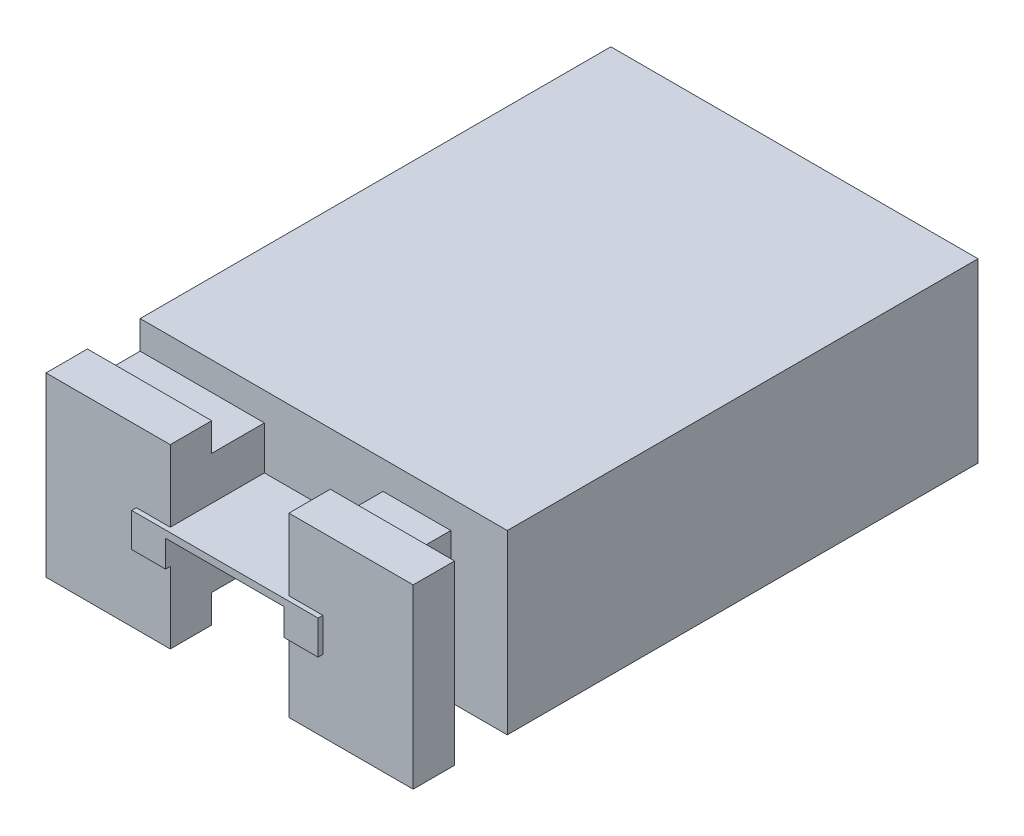
ISO-10303-21;
HEADER;
FILE_DESCRIPTION(('STEP AP214'),'2;1');
FILE_NAME('part.step','',(''),(''),'','','');
FILE_SCHEMA(('AUTOMOTIVE_DESIGN { 1 0 10303 214 1 1 1 1 }'));
ENDSEC;
DATA;
#1=APPLICATION_CONTEXT('core data for automotive mechanical design processes');
#2=APPLICATION_PROTOCOL_DEFINITION('international standard','automotive_design',2000,#1);
#3=PRODUCT_CONTEXT('',#1,'mechanical');
#4=PRODUCT('Part','Part','',(#3));
#5=PRODUCT_RELATED_PRODUCT_CATEGORY('part','',(#4));
#6=PRODUCT_DEFINITION_FORMATION('','',#4);
#7=PRODUCT_DEFINITION_CONTEXT('part definition',#1,'design');
#8=PRODUCT_DEFINITION('design','',#6,#7);
#9=PRODUCT_DEFINITION_SHAPE('','',#8);
#10=(LENGTH_UNIT() NAMED_UNIT(*) SI_UNIT(.MILLI.,.METRE.));
#11=(NAMED_UNIT(*) PLANE_ANGLE_UNIT() SI_UNIT($,.RADIAN.));
#12=(NAMED_UNIT(*) SI_UNIT($,.STERADIAN.) SOLID_ANGLE_UNIT());
#13=UNCERTAINTY_MEASURE_WITH_UNIT(LENGTH_MEASURE(1.E-05),#10,'distance_accuracy_value','');
#14=(GEOMETRIC_REPRESENTATION_CONTEXT(3) GLOBAL_UNCERTAINTY_ASSIGNED_CONTEXT((#13)) GLOBAL_UNIT_ASSIGNED_CONTEXT((#10,
#11,#12)) REPRESENTATION_CONTEXT('',''));
#15=CARTESIAN_POINT('',(0.,0.,0.));
#16=DIRECTION('',(0.,0.,1.));
#17=DIRECTION('',(1.,0.,0.));
#18=AXIS2_PLACEMENT_3D('',#15,#16,#17);
#19=CARTESIAN_POINT('',(-32.9327137211732,15.8981145597497,7.0612));
#20=DIRECTION('',(0.,0.,1.));
#21=DIRECTION('',(1.,0.,0.));
#22=AXIS2_PLACEMENT_3D('',#19,#20,#21);
#23=PLANE('',#22);
#24=DIRECTION('',(0.,1.,0.));
#25=VECTOR('',#24,1.);
#26=CARTESIAN_POINT('',(-32.9327137211732,18.2857145597497,7.0612));
#27=LINE('',#26,#25);
#28=CARTESIAN_POINT('',(-32.9327137211732,15.8981145597497,7.0612));
#29=VERTEX_POINT('',#28);
#30=CARTESIAN_POINT('',(-32.9327137211732,18.2857145597497,7.0612));
#31=VERTEX_POINT('',#30);
#32=EDGE_CURVE('E249',#29,#31,#27,.T.);
#33=ORIENTED_EDGE('',*,*,#32,.F.);
#34=DIRECTION('',(1.,0.,0.));
#35=VECTOR('',#34,1.);
#36=CARTESIAN_POINT('',(-32.9327137211732,15.8981145597497,7.0612));
#37=LINE('',#36,#35);
#38=CARTESIAN_POINT('',(-34.6091137211732,15.8981145597497,7.0612));
#39=VERTEX_POINT('',#38);
#40=EDGE_CURVE('E243',#39,#29,#37,.T.);
#41=ORIENTED_EDGE('',*,*,#40,.F.);
#42=DIRECTION('',(0.,1.,0.));
#43=VECTOR('',#42,1.);
#44=CARTESIAN_POINT('',(-34.6091137211732,15.8981145597497,7.0612));
#45=LINE('',#44,#43);
#46=CARTESIAN_POINT('',(-34.6091137211732,16.2791145597497,7.0612));
#47=VERTEX_POINT('',#46);
#48=EDGE_CURVE('E240',#47,#39,#45,.F.);
#49=ORIENTED_EDGE('',*,*,#48,.F.);
#50=DIRECTION('',(1.,0.,0.));
#51=VECTOR('',#50,1.);
#52=CARTESIAN_POINT('',(-32.9327137211732,16.2791145597497,7.0612));
#53=LINE('',#52,#51);
#54=CARTESIAN_POINT('',(-33.6947137211732,16.2791145597497,7.0612));
#55=VERTEX_POINT('',#54);
#56=EDGE_CURVE('E236',#55,#47,#53,.F.);
#57=ORIENTED_EDGE('',*,*,#56,.F.);
#58=DIRECTION('',(0.,1.,0.));
#59=VECTOR('',#58,1.);
#60=CARTESIAN_POINT('',(-33.6947137211732,15.8981145597497,7.0612));
#61=LINE('',#60,#59);
#62=CARTESIAN_POINT('',(-33.6947137211732,17.9047145597497,7.0612));
#63=VERTEX_POINT('',#62);
#64=EDGE_CURVE('E235',#63,#55,#61,.F.);
#65=ORIENTED_EDGE('',*,*,#64,.F.);
#66=DIRECTION('',(1.,0.,0.));
#67=VECTOR('',#66,1.);
#68=CARTESIAN_POINT('',(-32.9327137211732,17.9047145597497,7.0612));
#69=LINE('',#68,#67);
#70=CARTESIAN_POINT('',(-34.6091137211732,17.9047145597497,7.0612));
#71=VERTEX_POINT('',#70);
#72=EDGE_CURVE('E223',#71,#63,#69,.T.);
#73=ORIENTED_EDGE('',*,*,#72,.F.);
#74=DIRECTION('',(0.,1.,0.));
#75=VECTOR('',#74,1.);
#76=CARTESIAN_POINT('',(-34.6091137211732,15.8981145597497,7.0612));
#77=LINE('',#76,#75);
#78=CARTESIAN_POINT('',(-34.6091137211732,18.2857145597497,7.0612));
#79=VERTEX_POINT('',#78);
#80=EDGE_CURVE('E19',#79,#71,#77,.F.);
#81=ORIENTED_EDGE('',*,*,#80,.F.);
#82=DIRECTION('',(1.,0.,0.));
#83=VECTOR('',#82,1.);
#84=CARTESIAN_POINT('',(-32.9327137211732,18.2857145597497,7.0612));
#85=LINE('',#84,#83);
#86=EDGE_CURVE('E209',#31,#79,#85,.F.);
#87=ORIENTED_EDGE('',*,*,#86,.F.);
#88=EDGE_LOOP('',(#33,#41,#49,#57,#65,#73,#81,#87));
#89=FACE_BOUND('',#88,.T.);
#90=ADVANCED_FACE('F16',(#89),#23,.F.);
#91=CARTESIAN_POINT('',(-32.9327137211732,15.8981145597497,0.));
#92=DIRECTION('',(0.,-1.,0.));
#93=DIRECTION('',(0.,0.,-1.));
#94=AXIS2_PLACEMENT_3D('',#91,#92,#93);
#95=PLANE('',#94);
#96=DIRECTION('',(1.,0.,0.));
#97=VECTOR('',#96,1.);
#98=CARTESIAN_POINT('',(-35.4092137211732,15.8981145597497,7.62));
#99=LINE('',#98,#97);
#100=CARTESIAN_POINT('',(-34.6091137211732,15.8981145597497,7.62));
#101=VERTEX_POINT('',#100);
#102=CARTESIAN_POINT('',(-32.9327137211732,15.8981145597497,7.62));
#103=VERTEX_POINT('',#102);
#104=EDGE_CURVE('E267',#101,#103,#99,.T.);
#105=ORIENTED_EDGE('',*,*,#104,.F.);
#106=DIRECTION('',(0.,0.,-1.));
#107=VECTOR('',#106,1.);
#108=CARTESIAN_POINT('',(-34.6091137211732,15.8981145597497,0.));
#109=LINE('',#108,#107);
#110=EDGE_CURVE('E246',#101,#39,#109,.T.);
#111=ORIENTED_EDGE('',*,*,#110,.T.);
#112=ORIENTED_EDGE('',*,*,#40,.T.);
#113=DIRECTION('',(0.,0.,-1.));
#114=VECTOR('',#113,1.);
#115=CARTESIAN_POINT('',(-32.9327137211732,15.8981145597497,0.));
#116=LINE('',#115,#114);
#117=EDGE_CURVE('E252',#103,#29,#116,.T.);
#118=ORIENTED_EDGE('',*,*,#117,.F.);
#119=EDGE_LOOP('',(#105,#111,#112,#118));
#120=FACE_BOUND('',#119,.T.);
#121=ADVANCED_FACE('F555',(#120),#95,.T.);
#122=CARTESIAN_POINT('',(-32.9327137211732,18.2857145597497,0.));
#123=DIRECTION('',(1.,0.,0.));
#124=DIRECTION('',(0.,0.,-1.));
#125=AXIS2_PLACEMENT_3D('',#122,#123,#124);
#126=PLANE('',#125);
#127=DIRECTION('',(0.,1.,0.));
#128=VECTOR('',#127,1.);
#129=CARTESIAN_POINT('',(-32.9327137211732,17.0919145597497,7.62));
#130=LINE('',#129,#128);
#131=CARTESIAN_POINT('',(-32.9327137211732,18.2857145597497,7.62));
#132=VERTEX_POINT('',#131);
#133=EDGE_CURVE('E270',#103,#132,#130,.T.);
#134=ORIENTED_EDGE('',*,*,#133,.F.);
#135=ORIENTED_EDGE('',*,*,#117,.T.);
#136=ORIENTED_EDGE('',*,*,#32,.T.);
#137=DIRECTION('',(0.,0.,1.));
#138=VECTOR('',#137,1.);
#139=CARTESIAN_POINT('',(-32.9327137211732,18.2857145597497,0.));
#140=LINE('',#139,#138);
#141=EDGE_CURVE('E256',#132,#31,#140,.F.);
#142=ORIENTED_EDGE('',*,*,#141,.F.);
#143=EDGE_LOOP('',(#134,#135,#136,#142));
#144=FACE_BOUND('',#143,.T.);
#145=ADVANCED_FACE('F553',(#144),#126,.T.);
#146=CARTESIAN_POINT('',(-37.8857137211732,18.2857145597497,0.));
#147=DIRECTION('',(0.,1.,0.));
#148=DIRECTION('',(0.,0.,1.));
#149=AXIS2_PLACEMENT_3D('',#146,#147,#148);
#150=PLANE('',#149);
#151=DIRECTION('',(1.,0.,0.));
#152=VECTOR('',#151,1.);
#153=CARTESIAN_POINT('',(-35.4092137211732,18.2857145597497,7.62));
#154=LINE('',#153,#152);
#155=CARTESIAN_POINT('',(-34.6091137211732,18.2857145597497,7.62));
#156=VERTEX_POINT('',#155);
#157=EDGE_CURVE('E273',#132,#156,#154,.F.);
#158=ORIENTED_EDGE('',*,*,#157,.F.);
#159=ORIENTED_EDGE('',*,*,#141,.T.);
#160=ORIENTED_EDGE('',*,*,#86,.T.);
#161=DIRECTION('',(0.,0.,1.));
#162=VECTOR('',#161,1.);
#163=CARTESIAN_POINT('',(-34.6091137211732,18.2857145597497,0.));
#164=LINE('',#163,#162);
#165=EDGE_CURVE('E220',#79,#156,#164,.T.);
#166=ORIENTED_EDGE('',*,*,#165,.T.);
#167=EDGE_LOOP('',(#158,#159,#160,#166));
#168=FACE_BOUND('',#167,.T.);
#169=ADVANCED_FACE('F551',(#168),#150,.T.);
#170=CARTESIAN_POINT('',(-33.6947137211732,18.2857145597497,7.0612));
#171=DIRECTION('',(0.,0.,1.));
#172=DIRECTION('',(1.,0.,0.));
#173=AXIS2_PLACEMENT_3D('',#170,#171,#172);
#174=PLANE('',#173);
#175=DIRECTION('',(1.,0.,0.));
#176=VECTOR('',#175,1.);
#177=CARTESIAN_POINT('',(-33.6947137211732,17.9047145597497,7.0612));
#178=LINE('',#177,#176);
#179=CARTESIAN_POINT('',(-36.2093137211732,17.9047145597497,7.0612));
#180=VERTEX_POINT('',#179);
#181=CARTESIAN_POINT('',(-37.8857137211732,17.9047145597497,7.0612));
#182=VERTEX_POINT('',#181);
#183=EDGE_CURVE('E312',#180,#182,#178,.F.);
#184=ORIENTED_EDGE('',*,*,#183,.T.);
#185=DIRECTION('',(0.,1.,0.));
#186=VECTOR('',#185,1.);
#187=CARTESIAN_POINT('',(-37.8857137211732,18.2857145597497,7.0612));
#188=LINE('',#187,#186);
#189=CARTESIAN_POINT('',(-37.8857137211732,18.2857145597497,7.0612));
#190=VERTEX_POINT('',#189);
#191=EDGE_CURVE('E258',#190,#182,#188,.F.);
#192=ORIENTED_EDGE('',*,*,#191,.F.);
#193=DIRECTION('',(1.,0.,0.));
#194=VECTOR('',#193,1.);
#195=CARTESIAN_POINT('',(-37.8857137211732,18.2857145597497,7.0612));
#196=LINE('',#195,#194);
#197=CARTESIAN_POINT('',(-36.2093137211732,18.2857145597497,7.0612));
#198=VERTEX_POINT('',#197);
#199=EDGE_CURVE('E289',#198,#190,#196,.F.);
#200=ORIENTED_EDGE('',*,*,#199,.F.);
#201=DIRECTION('',(0.,1.,0.));
#202=VECTOR('',#201,1.);
#203=CARTESIAN_POINT('',(-36.2093137211732,15.8981145597497,7.0612));
#204=LINE('',#203,#202);
#205=EDGE_CURVE('E310',#198,#180,#204,.F.);
#206=ORIENTED_EDGE('',*,*,#205,.T.);
#207=EDGE_LOOP('',(#184,#192,#200,#206));
#208=FACE_BOUND('',#207,.T.);
#209=ADVANCED_FACE('F492',(#208),#174,.F.);
#210=CARTESIAN_POINT('',(-33.6947137211732,16.2791145597497,7.0612));
#211=DIRECTION('',(0.,0.,1.));
#212=DIRECTION('',(1.,0.,0.));
#213=AXIS2_PLACEMENT_3D('',#210,#211,#212);
#214=PLANE('',#213);
#215=DIRECTION('',(1.,0.,0.));
#216=VECTOR('',#215,1.);
#217=CARTESIAN_POINT('',(-33.6947137211732,16.2791145597497,7.0612));
#218=LINE('',#217,#216);
#219=CARTESIAN_POINT('',(-37.8857137211732,16.2791145597497,7.0612));
#220=VERTEX_POINT('',#219);
#221=CARTESIAN_POINT('',(-36.2093137211732,16.2791145597497,7.0612));
#222=VERTEX_POINT('',#221);
#223=EDGE_CURVE('E320',#220,#222,#218,.T.);
#224=ORIENTED_EDGE('',*,*,#223,.T.);
#225=DIRECTION('',(0.,1.,0.));
#226=VECTOR('',#225,1.);
#227=CARTESIAN_POINT('',(-36.2093137211732,16.2791145597497,7.0612));
#228=LINE('',#227,#226);
#229=CARTESIAN_POINT('',(-36.2093137211732,15.8981145597497,7.0612));
#230=VERTEX_POINT('',#229);
#231=EDGE_CURVE('E260',#230,#222,#228,.T.);
#232=ORIENTED_EDGE('',*,*,#231,.F.);
#233=DIRECTION('',(1.,0.,0.));
#234=VECTOR('',#233,1.);
#235=CARTESIAN_POINT('',(-32.9327137211732,15.8981145597497,7.0612));
#236=LINE('',#235,#234);
#237=CARTESIAN_POINT('',(-37.8857137211732,15.8981145597497,7.0612));
#238=VERTEX_POINT('',#237);
#239=EDGE_CURVE('E294',#238,#230,#236,.T.);
#240=ORIENTED_EDGE('',*,*,#239,.F.);
#241=DIRECTION('',(0.,1.,0.));
#242=VECTOR('',#241,1.);
#243=CARTESIAN_POINT('',(-37.8857137211732,16.2791145597497,7.0612));
#244=LINE('',#243,#242);
#245=EDGE_CURVE('E262',#220,#238,#244,.F.);
#246=ORIENTED_EDGE('',*,*,#245,.F.);
#247=EDGE_LOOP('',(#224,#232,#240,#246));
#248=FACE_BOUND('',#247,.T.);
#249=ADVANCED_FACE('F477',(#248),#214,.F.);
#250=CARTESIAN_POINT('',(-34.6091137211732,16.8633145597497,7.62));
#251=DIRECTION('',(0.,-1.,0.));
#252=DIRECTION('',(0.,0.,-1.));
#253=AXIS2_PLACEMENT_3D('',#250,#251,#252);
#254=PLANE('',#253);
#255=DIRECTION('',(1.,0.,0.));
#256=VECTOR('',#255,1.);
#257=CARTESIAN_POINT('',(-34.3805137211732,16.8633145597497,7.6835));
#258=LINE('',#257,#256);
#259=CARTESIAN_POINT('',(-34.6091137211732,16.8633145597497,7.6835));
#260=VERTEX_POINT('',#259);
#261=CARTESIAN_POINT('',(-34.1519137211732,16.8633145597497,7.6835));
#262=VERTEX_POINT('',#261);
#263=EDGE_CURVE('E278',#260,#262,#258,.T.);
#264=ORIENTED_EDGE('',*,*,#263,.F.);
#265=DIRECTION('',(0.,0.,-1.));
#266=VECTOR('',#265,1.);
#267=CARTESIAN_POINT('',(-34.6091137211732,16.8633145597497,6.35));
#268=LINE('',#267,#266);
#269=CARTESIAN_POINT('',(-34.6091137211732,16.8633145597497,7.62));
#270=VERTEX_POINT('',#269);
#271=EDGE_CURVE('E345',#260,#270,#268,.T.);
#272=ORIENTED_EDGE('',*,*,#271,.T.);
#273=DIRECTION('',(1.,0.,0.));
#274=VECTOR('',#273,1.);
#275=CARTESIAN_POINT('',(-35.4092137211732,16.8633145597497,7.62));
#276=LINE('',#275,#274);
#277=CARTESIAN_POINT('',(-34.1519137211732,16.8633145597497,7.62));
#278=VERTEX_POINT('',#277);
#279=EDGE_CURVE('E264',#278,#270,#276,.F.);
#280=ORIENTED_EDGE('',*,*,#279,.F.);
#281=DIRECTION('',(0.,0.,-1.));
#282=VECTOR('',#281,1.);
#283=CARTESIAN_POINT('',(-34.1519137211732,16.8633145597497,7.62));
#284=LINE('',#283,#282);
#285=EDGE_CURVE('E286',#262,#278,#284,.T.);
#286=ORIENTED_EDGE('',*,*,#285,.F.);
#287=EDGE_LOOP('',(#264,#272,#280,#286));
#288=FACE_BOUND('',#287,.T.);
#289=ADVANCED_FACE('F558',(#288),#254,.T.);
#290=CARTESIAN_POINT('',(-35.4092137211732,17.0919145597497,7.62));
#291=DIRECTION('',(0.,0.,1.));
#292=DIRECTION('',(1.,0.,0.));
#293=AXIS2_PLACEMENT_3D('',#290,#291,#292);
#294=PLANE('',#293);
#295=DIRECTION('',(1.,0.,0.));
#296=VECTOR('',#295,1.);
#297=CARTESIAN_POINT('',(-35.4092137211732,17.3205145597497,7.62));
#298=LINE('',#297,#296);
#299=CARTESIAN_POINT('',(-34.6091137211732,17.3205145597497,7.62));
#300=VERTEX_POINT('',#299);
#301=CARTESIAN_POINT('',(-34.1519137211732,17.3205145597497,7.62));
#302=VERTEX_POINT('',#301);
#303=EDGE_CURVE('E276',#300,#302,#298,.T.);
#304=ORIENTED_EDGE('',*,*,#303,.T.);
#305=DIRECTION('',(0.,1.,0.));
#306=VECTOR('',#305,1.);
#307=CARTESIAN_POINT('',(-34.1519137211732,16.8633145597497,7.62));
#308=LINE('',#307,#306);
#309=EDGE_CURVE('E280',#278,#302,#308,.T.);
#310=ORIENTED_EDGE('',*,*,#309,.F.);
#311=ORIENTED_EDGE('',*,*,#279,.T.);
#312=DIRECTION('',(0.,1.,0.));
#313=VECTOR('',#312,1.);
#314=CARTESIAN_POINT('',(-34.6091137211732,15.8981145597497,7.62));
#315=LINE('',#314,#313);
#316=EDGE_CURVE('E347',#270,#101,#315,.F.);
#317=ORIENTED_EDGE('',*,*,#316,.T.);
#318=ORIENTED_EDGE('',*,*,#104,.T.);
#319=ORIENTED_EDGE('',*,*,#133,.T.);
#320=ORIENTED_EDGE('',*,*,#157,.T.);
#321=DIRECTION('',(0.,1.,0.));
#322=VECTOR('',#321,1.);
#323=CARTESIAN_POINT('',(-34.6091137211732,15.8981145597497,7.62));
#324=LINE('',#323,#322);
#325=EDGE_CURVE('E230',#156,#300,#324,.F.);
#326=ORIENTED_EDGE('',*,*,#325,.T.);
#327=EDGE_LOOP('',(#304,#310,#311,#317,#318,#319,#320,#326));
#328=FACE_BOUND('',#327,.T.);
#329=ADVANCED_FACE('F548',(#328),#294,.T.);
#330=CARTESIAN_POINT('',(-34.3805137211732,17.0919145597497,7.6835));
#331=DIRECTION('',(0.,0.,1.));
#332=DIRECTION('',(1.,0.,0.));
#333=AXIS2_PLACEMENT_3D('',#330,#331,#332);
#334=PLANE('',#333);
#335=ORIENTED_EDGE('',*,*,#263,.T.);
#336=DIRECTION('',(0.,1.,0.));
#337=VECTOR('',#336,1.);
#338=CARTESIAN_POINT('',(-34.1519137211732,16.8633145597497,7.6835));
#339=LINE('',#338,#337);
#340=CARTESIAN_POINT('',(-34.1519137211732,17.3205145597497,7.6835));
#341=VERTEX_POINT('',#340);
#342=EDGE_CURVE('E283',#341,#262,#339,.F.);
#343=ORIENTED_EDGE('',*,*,#342,.F.);
#344=DIRECTION('',(1.,0.,0.));
#345=VECTOR('',#344,1.);
#346=CARTESIAN_POINT('',(-34.1519137211732,17.3205145597497,7.6835));
#347=LINE('',#346,#345);
#348=CARTESIAN_POINT('',(-36.6665137211732,17.3205145597497,7.6835));
#349=VERTEX_POINT('',#348);
#350=EDGE_CURVE('E370',#349,#341,#347,.T.);
#351=ORIENTED_EDGE('',*,*,#350,.F.);
#352=DIRECTION('',(0.,1.,0.));
#353=VECTOR('',#352,1.);
#354=CARTESIAN_POINT('',(-36.6665137211732,17.3205145597497,7.6835));
#355=LINE('',#354,#353);
#356=CARTESIAN_POINT('',(-36.6665137211732,16.8633145597497,7.6835));
#357=VERTEX_POINT('',#356);
#358=EDGE_CURVE('E305',#357,#349,#355,.T.);
#359=ORIENTED_EDGE('',*,*,#358,.F.);
#360=DIRECTION('',(1.,0.,0.));
#361=VECTOR('',#360,1.);
#362=CARTESIAN_POINT('',(-36.6665137211732,16.8633145597497,7.6835));
#363=LINE('',#362,#361);
#364=CARTESIAN_POINT('',(-36.2093137211732,16.8633145597497,7.6835));
#365=VERTEX_POINT('',#364);
#366=EDGE_CURVE('E300',#365,#357,#363,.F.);
#367=ORIENTED_EDGE('',*,*,#366,.F.);
#368=DIRECTION('',(0.,1.,0.));
#369=VECTOR('',#368,1.);
#370=CARTESIAN_POINT('',(-36.2093137211732,15.8981145597497,7.6835));
#371=LINE('',#370,#369);
#372=CARTESIAN_POINT('',(-36.2093137211732,17.2241961631307,7.6835));
#373=VERTEX_POINT('',#372);
#374=EDGE_CURVE('E334',#365,#373,#371,.T.);
#375=ORIENTED_EDGE('',*,*,#374,.T.);
#376=DIRECTION('',(1.,0.,0.));
#377=VECTOR('',#376,1.);
#378=CARTESIAN_POINT('',(-34.6091137211732,17.2241961631307,7.6835));
#379=LINE('',#378,#377);
#380=CARTESIAN_POINT('',(-34.6091137211732,17.2241961631307,7.6835));
#381=VERTEX_POINT('',#380);
#382=EDGE_CURVE('E336',#381,#373,#379,.F.);
#383=ORIENTED_EDGE('',*,*,#382,.F.);
#384=DIRECTION('',(0.,1.,0.));
#385=VECTOR('',#384,1.);
#386=CARTESIAN_POINT('',(-34.6091137211732,15.8981145597497,7.6835));
#387=LINE('',#386,#385);
#388=EDGE_CURVE('E342',#381,#260,#387,.F.);
#389=ORIENTED_EDGE('',*,*,#388,.T.);
#390=EDGE_LOOP('',(#335,#343,#351,#359,#367,#375,#383,#389));
#391=FACE_BOUND('',#390,.T.);
#392=ADVANCED_FACE('F542',(#391),#334,.T.);
#393=CARTESIAN_POINT('',(-34.1519137211732,16.8633145597497,7.62));
#394=DIRECTION('',(1.,0.,0.));
#395=DIRECTION('',(0.,0.,-1.));
#396=AXIS2_PLACEMENT_3D('',#393,#394,#395);
#397=PLANE('',#396);
#398=ORIENTED_EDGE('',*,*,#342,.T.);
#399=ORIENTED_EDGE('',*,*,#285,.T.);
#400=ORIENTED_EDGE('',*,*,#309,.T.);
#401=DIRECTION('',(0.,0.,1.));
#402=VECTOR('',#401,1.);
#403=CARTESIAN_POINT('',(-34.1519137211732,17.3205145597497,7.62));
#404=LINE('',#403,#402);
#405=EDGE_CURVE('E373',#341,#302,#404,.F.);
#406=ORIENTED_EDGE('',*,*,#405,.F.);
#407=EDGE_LOOP('',(#398,#399,#400,#406));
#408=FACE_BOUND('',#407,.T.);
#409=ADVANCED_FACE('F545',(#408),#397,.T.);
#410=CARTESIAN_POINT('',(-37.8857137211732,18.2857145597497,0.));
#411=DIRECTION('',(0.,1.,0.));
#412=DIRECTION('',(0.,0.,1.));
#413=AXIS2_PLACEMENT_3D('',#410,#411,#412);
#414=PLANE('',#413);
#415=DIRECTION('',(1.,0.,0.));
#416=VECTOR('',#415,1.);
#417=CARTESIAN_POINT('',(-35.4092137211732,18.2857145597497,7.62));
#418=LINE('',#417,#416);
#419=CARTESIAN_POINT('',(-36.2093137211732,18.2857145597497,7.62));
#420=VERTEX_POINT('',#419);
#421=CARTESIAN_POINT('',(-37.8857137211732,18.2857145597497,7.62));
#422=VERTEX_POINT('',#421);
#423=EDGE_CURVE('E382',#420,#422,#418,.F.);
#424=ORIENTED_EDGE('',*,*,#423,.F.);
#425=DIRECTION('',(0.,0.,1.));
#426=VECTOR('',#425,1.);
#427=CARTESIAN_POINT('',(-36.2093137211732,18.2857145597497,7.62));
#428=LINE('',#427,#426);
#429=EDGE_CURVE('E307',#420,#198,#428,.F.);
#430=ORIENTED_EDGE('',*,*,#429,.T.);
#431=ORIENTED_EDGE('',*,*,#199,.T.);
#432=DIRECTION('',(0.,0.,1.));
#433=VECTOR('',#432,1.);
#434=CARTESIAN_POINT('',(-37.8857137211732,18.2857145597497,0.));
#435=LINE('',#434,#433);
#436=EDGE_CURVE('E292',#190,#422,#435,.T.);
#437=ORIENTED_EDGE('',*,*,#436,.T.);
#438=EDGE_LOOP('',(#424,#430,#431,#437));
#439=FACE_BOUND('',#438,.T.);
#440=ADVANCED_FACE('F489',(#439),#414,.T.);
#441=CARTESIAN_POINT('',(-32.9327137211732,15.8981145597497,0.));
#442=DIRECTION('',(0.,-1.,0.));
#443=DIRECTION('',(0.,0.,-1.));
#444=AXIS2_PLACEMENT_3D('',#441,#442,#443);
#445=PLANE('',#444);
#446=DIRECTION('',(1.,0.,0.));
#447=VECTOR('',#446,1.);
#448=CARTESIAN_POINT('',(-35.4092137211732,15.8981145597497,7.62));
#449=LINE('',#448,#447);
#450=CARTESIAN_POINT('',(-37.8857137211732,15.8981145597497,7.62));
#451=VERTEX_POINT('',#450);
#452=CARTESIAN_POINT('',(-36.2093137211732,15.8981145597497,7.62));
#453=VERTEX_POINT('',#452);
#454=EDGE_CURVE('E385',#451,#453,#449,.T.);
#455=ORIENTED_EDGE('',*,*,#454,.F.);
#456=DIRECTION('',(0.,0.,-1.));
#457=VECTOR('',#456,1.);
#458=CARTESIAN_POINT('',(-37.8857137211732,15.8981145597497,0.));
#459=LINE('',#458,#457);
#460=EDGE_CURVE('E297',#451,#238,#459,.T.);
#461=ORIENTED_EDGE('',*,*,#460,.T.);
#462=ORIENTED_EDGE('',*,*,#239,.T.);
#463=DIRECTION('',(0.,0.,1.));
#464=VECTOR('',#463,1.);
#465=CARTESIAN_POINT('',(-36.2093137211732,15.8981145597497,7.62));
#466=LINE('',#465,#464);
#467=EDGE_CURVE('E329',#230,#453,#466,.T.);
#468=ORIENTED_EDGE('',*,*,#467,.T.);
#469=EDGE_LOOP('',(#455,#461,#462,#468));
#470=FACE_BOUND('',#469,.T.);
#471=ADVANCED_FACE('F481',(#470),#445,.T.);
#472=CARTESIAN_POINT('',(-36.6665137211732,16.8633145597497,7.62));
#473=DIRECTION('',(0.,-1.,0.));
#474=DIRECTION('',(0.,0.,-1.));
#475=AXIS2_PLACEMENT_3D('',#472,#473,#474);
#476=PLANE('',#475);
#477=ORIENTED_EDGE('',*,*,#366,.T.);
#478=DIRECTION('',(0.,0.,1.));
#479=VECTOR('',#478,1.);
#480=CARTESIAN_POINT('',(-36.6665137211732,16.8633145597497,7.62));
#481=LINE('',#480,#479);
#482=CARTESIAN_POINT('',(-36.6665137211732,16.8633145597497,7.62));
#483=VERTEX_POINT('',#482);
#484=EDGE_CURVE('E302',#483,#357,#481,.T.);
#485=ORIENTED_EDGE('',*,*,#484,.F.);
#486=DIRECTION('',(1.,0.,0.));
#487=VECTOR('',#486,1.);
#488=CARTESIAN_POINT('',(-35.4092137211732,16.8633145597497,7.62));
#489=LINE('',#488,#487);
#490=CARTESIAN_POINT('',(-36.2093137211732,16.8633145597497,7.62));
#491=VERTEX_POINT('',#490);
#492=EDGE_CURVE('E391',#491,#483,#489,.F.);
#493=ORIENTED_EDGE('',*,*,#492,.F.);
#494=DIRECTION('',(0.,0.,1.));
#495=VECTOR('',#494,1.);
#496=CARTESIAN_POINT('',(-36.2093137211732,16.8633145597497,7.62));
#497=LINE('',#496,#495);
#498=EDGE_CURVE('E331',#491,#365,#497,.T.);
#499=ORIENTED_EDGE('',*,*,#498,.T.);
#500=EDGE_LOOP('',(#477,#485,#493,#499));
#501=FACE_BOUND('',#500,.T.);
#502=ADVANCED_FACE('F535',(#501),#476,.T.);
#503=CARTESIAN_POINT('',(-36.6665137211732,17.3205145597497,7.62));
#504=DIRECTION('',(-1.,0.,0.));
#505=DIRECTION('',(0.,0.,1.));
#506=AXIS2_PLACEMENT_3D('',#503,#504,#505);
#507=PLANE('',#506);
#508=ORIENTED_EDGE('',*,*,#358,.T.);
#509=DIRECTION('',(0.,0.,1.));
#510=VECTOR('',#509,1.);
#511=CARTESIAN_POINT('',(-36.6665137211732,17.3205145597497,7.62));
#512=LINE('',#511,#510);
#513=CARTESIAN_POINT('',(-36.6665137211732,17.3205145597497,7.62));
#514=VERTEX_POINT('',#513);
#515=EDGE_CURVE('E367',#514,#349,#512,.T.);
#516=ORIENTED_EDGE('',*,*,#515,.F.);
#517=DIRECTION('',(0.,1.,0.));
#518=VECTOR('',#517,1.);
#519=CARTESIAN_POINT('',(-36.6665137211732,17.0919145597497,7.62));
#520=LINE('',#519,#518);
#521=EDGE_CURVE('E394',#483,#514,#520,.T.);
#522=ORIENTED_EDGE('',*,*,#521,.F.);
#523=ORIENTED_EDGE('',*,*,#484,.T.);
#524=EDGE_LOOP('',(#508,#516,#522,#523));
#525=FACE_BOUND('',#524,.T.);
#526=ADVANCED_FACE('F538',(#525),#507,.T.);
#527=CARTESIAN_POINT('',(-36.2093137211732,15.8981145597497,7.62));
#528=DIRECTION('',(-1.,0.,0.));
#529=DIRECTION('',(0.,0.,1.));
#530=AXIS2_PLACEMENT_3D('',#527,#528,#529);
#531=PLANE('',#530);
#532=DIRECTION('',(0.,1.,0.));
#533=VECTOR('',#532,1.);
#534=CARTESIAN_POINT('',(-36.2093137211732,15.8981145597497,6.35));
#535=LINE('',#534,#533);
#536=CARTESIAN_POINT('',(-36.2093137211732,17.3205145597497,6.35));
#537=VERTEX_POINT('',#536);
#538=CARTESIAN_POINT('',(-36.2093137211732,17.9047145597497,6.35));
#539=VERTEX_POINT('',#538);
#540=EDGE_CURVE('E397',#537,#539,#535,.T.);
#541=ORIENTED_EDGE('',*,*,#540,.T.);
#542=DIRECTION('',(0.,0.,-1.));
#543=VECTOR('',#542,1.);
#544=CARTESIAN_POINT('',(-36.2093137211732,17.9047145597497,7.0612));
#545=LINE('',#544,#543);
#546=EDGE_CURVE('E317',#539,#180,#545,.F.);
#547=ORIENTED_EDGE('',*,*,#546,.T.);
#548=ORIENTED_EDGE('',*,*,#205,.F.);
#549=ORIENTED_EDGE('',*,*,#429,.F.);
#550=DIRECTION('',(0.,1.,0.));
#551=VECTOR('',#550,1.);
#552=CARTESIAN_POINT('',(-36.2093137211732,17.0919145597497,7.62));
#553=LINE('',#552,#551);
#554=CARTESIAN_POINT('',(-36.2093137211732,17.3205145597497,7.62));
#555=VERTEX_POINT('',#554);
#556=EDGE_CURVE('E379',#555,#420,#553,.T.);
#557=ORIENTED_EDGE('',*,*,#556,.F.);
#558=DIRECTION('',(0.,0.,1.));
#559=VECTOR('',#558,1.);
#560=CARTESIAN_POINT('',(-36.2093137211732,17.3205145597497,7.62));
#561=LINE('',#560,#559);
#562=EDGE_CURVE('E365',#537,#555,#561,.T.);
#563=ORIENTED_EDGE('',*,*,#562,.F.);
#564=EDGE_LOOP('',(#541,#547,#548,#549,#557,#563));
#565=FACE_BOUND('',#564,.T.);
#566=ADVANCED_FACE('F502',(#565),#531,.F.);
#567=CARTESIAN_POINT('',(-33.6947137211732,17.9047145597497,7.0612));
#568=DIRECTION('',(0.,-1.,0.));
#569=DIRECTION('',(0.,0.,-1.));
#570=AXIS2_PLACEMENT_3D('',#567,#568,#569);
#571=PLANE('',#570);
#572=DIRECTION('',(-1.,0.,0.));
#573=VECTOR('',#572,1.);
#574=CARTESIAN_POINT('',(-33.6947137211732,17.9047145597497,6.35));
#575=LINE('',#574,#573);
#576=CARTESIAN_POINT('',(-37.8857137211732,17.9047145597497,6.35));
#577=VERTEX_POINT('',#576);
#578=EDGE_CURVE('E399',#539,#577,#575,.T.);
#579=ORIENTED_EDGE('',*,*,#578,.T.);
#580=DIRECTION('',(0.,0.,-1.));
#581=VECTOR('',#580,1.);
#582=CARTESIAN_POINT('',(-37.8857137211732,17.9047145597497,7.0612));
#583=LINE('',#582,#581);
#584=EDGE_CURVE('E315',#182,#577,#583,.T.);
#585=ORIENTED_EDGE('',*,*,#584,.F.);
#586=ORIENTED_EDGE('',*,*,#183,.F.);
#587=ORIENTED_EDGE('',*,*,#546,.F.);
#588=EDGE_LOOP('',(#579,#585,#586,#587));
#589=FACE_BOUND('',#588,.T.);
#590=ADVANCED_FACE('F498',(#589),#571,.F.);
#591=CARTESIAN_POINT('',(-33.6947137211732,16.2791145597497,6.35));
#592=DIRECTION('',(0.,1.,0.));
#593=DIRECTION('',(0.,0.,1.));
#594=AXIS2_PLACEMENT_3D('',#591,#592,#593);
#595=PLANE('',#594);
#596=DIRECTION('',(-1.,0.,0.));
#597=VECTOR('',#596,1.);
#598=CARTESIAN_POINT('',(-33.6947137211732,16.2791145597497,6.35));
#599=LINE('',#598,#597);
#600=CARTESIAN_POINT('',(-37.8857137211732,16.2791145597497,6.35));
#601=VERTEX_POINT('',#600);
#602=CARTESIAN_POINT('',(-36.2093137211732,16.2791145597497,6.35));
#603=VERTEX_POINT('',#602);
#604=EDGE_CURVE('E404',#601,#603,#599,.F.);
#605=ORIENTED_EDGE('',*,*,#604,.T.);
#606=DIRECTION('',(0.,0.,1.));
#607=VECTOR('',#606,1.);
#608=CARTESIAN_POINT('',(-36.2093137211732,16.2791145597497,7.62));
#609=LINE('',#608,#607);
#610=EDGE_CURVE('E326',#603,#222,#609,.T.);
#611=ORIENTED_EDGE('',*,*,#610,.T.);
#612=ORIENTED_EDGE('',*,*,#223,.F.);
#613=DIRECTION('',(0.,0.,1.));
#614=VECTOR('',#613,1.);
#615=CARTESIAN_POINT('',(-37.8857137211732,16.2791145597497,6.35));
#616=LINE('',#615,#614);
#617=EDGE_CURVE('E323',#601,#220,#616,.T.);
#618=ORIENTED_EDGE('',*,*,#617,.F.);
#619=EDGE_LOOP('',(#605,#611,#612,#618));
#620=FACE_BOUND('',#619,.T.);
#621=ADVANCED_FACE('F474',(#620),#595,.F.);
#622=CARTESIAN_POINT('',(-36.2093137211732,15.8981145597497,7.62));
#623=DIRECTION('',(-1.,0.,0.));
#624=DIRECTION('',(0.,0.,1.));
#625=AXIS2_PLACEMENT_3D('',#622,#623,#624);
#626=PLANE('',#625);
#627=ORIENTED_EDGE('',*,*,#374,.F.);
#628=ORIENTED_EDGE('',*,*,#498,.F.);
#629=DIRECTION('',(0.,1.,0.));
#630=VECTOR('',#629,1.);
#631=CARTESIAN_POINT('',(-36.2093137211732,17.0919145597497,7.62));
#632=LINE('',#631,#630);
#633=EDGE_CURVE('E388',#453,#491,#632,.T.);
#634=ORIENTED_EDGE('',*,*,#633,.F.);
#635=ORIENTED_EDGE('',*,*,#467,.F.);
#636=ORIENTED_EDGE('',*,*,#231,.T.);
#637=ORIENTED_EDGE('',*,*,#610,.F.);
#638=DIRECTION('',(0.,1.,0.));
#639=VECTOR('',#638,1.);
#640=CARTESIAN_POINT('',(-36.2093137211732,15.8981145597497,6.35));
#641=LINE('',#640,#639);
#642=CARTESIAN_POINT('',(-36.2093137211732,17.2241961631307,6.35));
#643=VERTEX_POINT('',#642);
#644=EDGE_CURVE('E406',#603,#643,#641,.T.);
#645=ORIENTED_EDGE('',*,*,#644,.T.);
#646=DIRECTION('',(0.,0.,-1.));
#647=VECTOR('',#646,1.);
#648=CARTESIAN_POINT('',(-36.2093137211732,17.2241961631307,6.35));
#649=LINE('',#648,#647);
#650=EDGE_CURVE('E339',#373,#643,#649,.T.);
#651=ORIENTED_EDGE('',*,*,#650,.F.);
#652=EDGE_LOOP('',(#627,#628,#634,#635,#636,#637,#645,#651));
#653=FACE_BOUND('',#652,.T.);
#654=ADVANCED_FACE('F530',(#653),#626,.F.);
#655=CARTESIAN_POINT('',(-34.6091137211732,17.2241961631307,6.35));
#656=DIRECTION('',(0.,-1.,0.));
#657=DIRECTION('',(0.,0.,-1.));
#658=AXIS2_PLACEMENT_3D('',#655,#656,#657);
#659=PLANE('',#658);
#660=DIRECTION('',(-1.,0.,0.));
#661=VECTOR('',#660,1.);
#662=CARTESIAN_POINT('',(-33.6947137211732,17.2241961631307,6.35));
#663=LINE('',#662,#661);
#664=CARTESIAN_POINT('',(-34.6091137211732,17.2241961631307,6.35));
#665=VERTEX_POINT('',#664);
#666=EDGE_CURVE('E408',#643,#665,#663,.F.);
#667=ORIENTED_EDGE('',*,*,#666,.T.);
#668=DIRECTION('',(0.,0.,-1.));
#669=VECTOR('',#668,1.);
#670=CARTESIAN_POINT('',(-34.6091137211732,17.2241961631307,6.35));
#671=LINE('',#670,#669);
#672=EDGE_CURVE('E350',#665,#381,#671,.F.);
#673=ORIENTED_EDGE('',*,*,#672,.T.);
#674=ORIENTED_EDGE('',*,*,#382,.T.);
#675=ORIENTED_EDGE('',*,*,#650,.T.);
#676=EDGE_LOOP('',(#667,#673,#674,#675));
#677=FACE_BOUND('',#676,.T.);
#678=ADVANCED_FACE('F526',(#677),#659,.T.);
#679=CARTESIAN_POINT('',(-34.6091137211732,15.8981145597497,6.35));
#680=DIRECTION('',(1.,0.,0.));
#681=DIRECTION('',(0.,0.,-1.));
#682=AXIS2_PLACEMENT_3D('',#679,#680,#681);
#683=PLANE('',#682);
#684=DIRECTION('',(0.,1.,0.));
#685=VECTOR('',#684,1.);
#686=CARTESIAN_POINT('',(-34.6091137211732,15.8981145597497,6.35));
#687=LINE('',#686,#685);
#688=CARTESIAN_POINT('',(-34.6091137211732,16.2791145597497,6.35));
#689=VERTEX_POINT('',#688);
#690=EDGE_CURVE('E410',#665,#689,#687,.F.);
#691=ORIENTED_EDGE('',*,*,#690,.T.);
#692=DIRECTION('',(0.,0.,1.));
#693=VECTOR('',#692,1.);
#694=CARTESIAN_POINT('',(-34.6091137211732,16.2791145597497,6.35));
#695=LINE('',#694,#693);
#696=EDGE_CURVE('E353',#689,#47,#695,.T.);
#697=ORIENTED_EDGE('',*,*,#696,.T.);
#698=ORIENTED_EDGE('',*,*,#48,.T.);
#699=ORIENTED_EDGE('',*,*,#110,.F.);
#700=ORIENTED_EDGE('',*,*,#316,.F.);
#701=ORIENTED_EDGE('',*,*,#271,.F.);
#702=ORIENTED_EDGE('',*,*,#388,.F.);
#703=ORIENTED_EDGE('',*,*,#672,.F.);
#704=EDGE_LOOP('',(#691,#697,#698,#699,#700,#701,#702,#703));
#705=FACE_BOUND('',#704,.T.);
#706=ADVANCED_FACE('F519',(#705),#683,.F.);
#707=CARTESIAN_POINT('',(-33.6947137211732,16.2791145597497,6.35));
#708=DIRECTION('',(0.,1.,0.));
#709=DIRECTION('',(0.,0.,1.));
#710=AXIS2_PLACEMENT_3D('',#707,#708,#709);
#711=PLANE('',#710);
#712=DIRECTION('',(-1.,0.,0.));
#713=VECTOR('',#712,1.);
#714=CARTESIAN_POINT('',(-33.6947137211732,16.2791145597497,6.35));
#715=LINE('',#714,#713);
#716=CARTESIAN_POINT('',(-33.6947137211732,16.2791145597497,6.35));
#717=VERTEX_POINT('',#716);
#718=EDGE_CURVE('E412',#689,#717,#715,.F.);
#719=ORIENTED_EDGE('',*,*,#718,.T.);
#720=DIRECTION('',(0.,0.,1.));
#721=VECTOR('',#720,1.);
#722=CARTESIAN_POINT('',(-33.6947137211732,16.2791145597497,7.0612));
#723=LINE('',#722,#721);
#724=EDGE_CURVE('E356',#717,#55,#723,.T.);
#725=ORIENTED_EDGE('',*,*,#724,.T.);
#726=ORIENTED_EDGE('',*,*,#56,.T.);
#727=ORIENTED_EDGE('',*,*,#696,.F.);
#728=EDGE_LOOP('',(#719,#725,#726,#727));
#729=FACE_BOUND('',#728,.T.);
#730=ADVANCED_FACE('F514',(#729),#711,.F.);
#731=CARTESIAN_POINT('',(-33.6947137211732,15.8981145597497,7.0612));
#732=DIRECTION('',(-1.,0.,0.));
#733=DIRECTION('',(0.,0.,1.));
#734=AXIS2_PLACEMENT_3D('',#731,#732,#733);
#735=PLANE('',#734);
#736=DIRECTION('',(0.,1.,0.));
#737=VECTOR('',#736,1.);
#738=CARTESIAN_POINT('',(-33.6947137211732,15.8981145597497,6.35));
#739=LINE('',#738,#737);
#740=CARTESIAN_POINT('',(-33.6947137211732,17.9047145597497,6.35));
#741=VERTEX_POINT('',#740);
#742=EDGE_CURVE('E414',#717,#741,#739,.T.);
#743=ORIENTED_EDGE('',*,*,#742,.T.);
#744=DIRECTION('',(0.,0.,-1.));
#745=VECTOR('',#744,1.);
#746=CARTESIAN_POINT('',(-33.6947137211732,17.9047145597497,7.0612));
#747=LINE('',#746,#745);
#748=EDGE_CURVE('E231',#741,#63,#747,.F.);
#749=ORIENTED_EDGE('',*,*,#748,.T.);
#750=ORIENTED_EDGE('',*,*,#64,.T.);
#751=ORIENTED_EDGE('',*,*,#724,.F.);
#752=EDGE_LOOP('',(#743,#749,#750,#751));
#753=FACE_BOUND('',#752,.T.);
#754=ADVANCED_FACE('F512',(#753),#735,.F.);
#755=CARTESIAN_POINT('',(-33.6947137211732,17.9047145597497,7.0612));
#756=DIRECTION('',(0.,-1.,0.));
#757=DIRECTION('',(0.,0.,-1.));
#758=AXIS2_PLACEMENT_3D('',#755,#756,#757);
#759=PLANE('',#758);
#760=ORIENTED_EDGE('',*,*,#72,.T.);
#761=ORIENTED_EDGE('',*,*,#748,.F.);
#762=DIRECTION('',(-1.,0.,0.));
#763=VECTOR('',#762,1.);
#764=CARTESIAN_POINT('',(-33.6947137211732,17.9047145597497,6.35));
#765=LINE('',#764,#763);
#766=CARTESIAN_POINT('',(-34.6091137211732,17.9047145597497,6.35));
#767=VERTEX_POINT('',#766);
#768=EDGE_CURVE('E229',#741,#767,#765,.T.);
#769=ORIENTED_EDGE('',*,*,#768,.T.);
#770=DIRECTION('',(0.,0.,-1.));
#771=VECTOR('',#770,1.);
#772=CARTESIAN_POINT('',(-34.6091137211732,17.9047145597497,6.35));
#773=LINE('',#772,#771);
#774=EDGE_CURVE('E218',#767,#71,#773,.F.);
#775=ORIENTED_EDGE('',*,*,#774,.T.);
#776=EDGE_LOOP('',(#760,#761,#769,#775));
#777=FACE_BOUND('',#776,.T.);
#778=ADVANCED_FACE('F225',(#777),#759,.F.);
#779=CARTESIAN_POINT('',(-34.6091137211732,15.8981145597497,6.35));
#780=DIRECTION('',(1.,0.,0.));
#781=DIRECTION('',(0.,0.,-1.));
#782=AXIS2_PLACEMENT_3D('',#779,#780,#781);
#783=PLANE('',#782);
#784=ORIENTED_EDGE('',*,*,#325,.F.);
#785=ORIENTED_EDGE('',*,*,#165,.F.);
#786=ORIENTED_EDGE('',*,*,#80,.T.);
#787=ORIENTED_EDGE('',*,*,#774,.F.);
#788=DIRECTION('',(0.,1.,0.));
#789=VECTOR('',#788,1.);
#790=CARTESIAN_POINT('',(-34.6091137211732,15.8981145597497,6.35));
#791=LINE('',#790,#789);
#792=CARTESIAN_POINT('',(-34.6091137211732,17.3205145597497,6.35));
#793=VERTEX_POINT('',#792);
#794=EDGE_CURVE('E417',#767,#793,#791,.F.);
#795=ORIENTED_EDGE('',*,*,#794,.T.);
#796=DIRECTION('',(0.,0.,1.));
#797=VECTOR('',#796,1.);
#798=CARTESIAN_POINT('',(-34.6091137211732,17.3205145597497,7.62));
#799=LINE('',#798,#797);
#800=EDGE_CURVE('E362',#300,#793,#799,.F.);
#801=ORIENTED_EDGE('',*,*,#800,.F.);
#802=EDGE_LOOP('',(#784,#785,#786,#787,#795,#801));
#803=FACE_BOUND('',#802,.T.);
#804=ADVANCED_FACE('F217',(#803),#783,.F.);
#805=CARTESIAN_POINT('',(-34.1519137211732,17.3205145597497,7.62));
#806=DIRECTION('',(0.,1.,0.));
#807=DIRECTION('',(0.,0.,1.));
#808=AXIS2_PLACEMENT_3D('',#805,#806,#807);
#809=PLANE('',#808);
#810=ORIENTED_EDGE('',*,*,#350,.T.);
#811=ORIENTED_EDGE('',*,*,#405,.T.);
#812=ORIENTED_EDGE('',*,*,#303,.F.);
#813=ORIENTED_EDGE('',*,*,#800,.T.);
#814=DIRECTION('',(-1.,0.,0.));
#815=VECTOR('',#814,1.);
#816=CARTESIAN_POINT('',(-33.6947137211732,17.3205145597497,6.35));
#817=LINE('',#816,#815);
#818=EDGE_CURVE('E419',#793,#537,#817,.T.);
#819=ORIENTED_EDGE('',*,*,#818,.T.);
#820=ORIENTED_EDGE('',*,*,#562,.T.);
#821=DIRECTION('',(1.,0.,0.));
#822=VECTOR('',#821,1.);
#823=CARTESIAN_POINT('',(-35.4092137211732,17.3205145597497,7.62));
#824=LINE('',#823,#822);
#825=EDGE_CURVE('E376',#514,#555,#824,.T.);
#826=ORIENTED_EDGE('',*,*,#825,.F.);
#827=ORIENTED_EDGE('',*,*,#515,.T.);
#828=EDGE_LOOP('',(#810,#811,#812,#813,#819,#820,#826,#827));
#829=FACE_BOUND('',#828,.T.);
#830=ADVANCED_FACE('F505',(#829),#809,.T.);
#831=CARTESIAN_POINT('',(-35.4092137211732,17.0919145597497,7.62));
#832=DIRECTION('',(0.,0.,1.));
#833=DIRECTION('',(1.,0.,0.));
#834=AXIS2_PLACEMENT_3D('',#831,#832,#833);
#835=PLANE('',#834);
#836=ORIENTED_EDGE('',*,*,#492,.T.);
#837=ORIENTED_EDGE('',*,*,#521,.T.);
#838=ORIENTED_EDGE('',*,*,#825,.T.);
#839=ORIENTED_EDGE('',*,*,#556,.T.);
#840=ORIENTED_EDGE('',*,*,#423,.T.);
#841=DIRECTION('',(0.,1.,0.));
#842=VECTOR('',#841,1.);
#843=CARTESIAN_POINT('',(-37.8857137211732,15.8981145597497,7.62));
#844=LINE('',#843,#842);
#845=EDGE_CURVE('E422',#451,#422,#844,.T.);
#846=ORIENTED_EDGE('',*,*,#845,.F.);
#847=ORIENTED_EDGE('',*,*,#454,.T.);
#848=ORIENTED_EDGE('',*,*,#633,.T.);
#849=EDGE_LOOP('',(#836,#837,#838,#839,#840,#846,#847,#848));
#850=FACE_BOUND('',#849,.T.);
#851=ADVANCED_FACE('F485',(#850),#835,.T.);
#852=CARTESIAN_POINT('',(-37.8857137211732,18.2857145597497,0.));
#853=DIRECTION('',(0.,1.,0.));
#854=DIRECTION('',(0.,0.,1.));
#855=AXIS2_PLACEMENT_3D('',#852,#853,#854);
#856=PLANE('',#855);
#857=DIRECTION('',(1.,0.,0.));
#858=VECTOR('',#857,1.);
#859=CARTESIAN_POINT('',(-35.4092137211732,18.2857145597497,0.));
#860=LINE('',#859,#858);
#861=CARTESIAN_POINT('',(-32.9327137211732,18.2857145597497,0.));
#862=VERTEX_POINT('',#861);
#863=CARTESIAN_POINT('',(-37.8857137211732,18.2857145597497,0.));
#864=VERTEX_POINT('',#863);
#865=EDGE_CURVE('E435',#862,#864,#860,.F.);
#866=ORIENTED_EDGE('',*,*,#865,.T.);
#867=DIRECTION('',(0.,0.,1.));
#868=VECTOR('',#867,1.);
#869=CARTESIAN_POINT('',(-37.8857137211732,18.2857145597497,0.));
#870=LINE('',#869,#868);
#871=CARTESIAN_POINT('',(-37.8857137211732,18.2857145597497,6.35));
#872=VERTEX_POINT('',#871);
#873=EDGE_CURVE('E428',#872,#864,#870,.F.);
#874=ORIENTED_EDGE('',*,*,#873,.F.);
#875=DIRECTION('',(-1.,0.,0.));
#876=VECTOR('',#875,1.);
#877=CARTESIAN_POINT('',(-33.6947137211732,18.2857145597497,6.35));
#878=LINE('',#877,#876);
#879=CARTESIAN_POINT('',(-32.9327137211732,18.2857145597497,6.35));
#880=VERTEX_POINT('',#879);
#881=EDGE_CURVE('E402',#872,#880,#878,.F.);
#882=ORIENTED_EDGE('',*,*,#881,.T.);
#883=DIRECTION('',(0.,0.,-1.));
#884=VECTOR('',#883,1.);
#885=CARTESIAN_POINT('',(-32.9327137211732,18.2857145597497,0.));
#886=LINE('',#885,#884);
#887=EDGE_CURVE('E442',#862,#880,#886,.F.);
#888=ORIENTED_EDGE('',*,*,#887,.F.);
#889=EDGE_LOOP('',(#866,#874,#882,#888));
#890=FACE_BOUND('',#889,.T.);
#891=ADVANCED_FACE('F463',(#890),#856,.T.);
#892=CARTESIAN_POINT('',(-33.6947137211732,15.8981145597497,6.35));
#893=DIRECTION('',(0.,0.,-1.));
#894=DIRECTION('',(-1.,0.,0.));
#895=AXIS2_PLACEMENT_3D('',#892,#893,#894);
#896=PLANE('',#895);
#897=ORIENTED_EDGE('',*,*,#794,.F.);
#898=ORIENTED_EDGE('',*,*,#768,.F.);
#899=ORIENTED_EDGE('',*,*,#742,.F.);
#900=ORIENTED_EDGE('',*,*,#718,.F.);
#901=ORIENTED_EDGE('',*,*,#690,.F.);
#902=ORIENTED_EDGE('',*,*,#666,.F.);
#903=ORIENTED_EDGE('',*,*,#644,.F.);
#904=ORIENTED_EDGE('',*,*,#604,.F.);
#905=DIRECTION('',(0.,1.,0.));
#906=VECTOR('',#905,1.);
#907=CARTESIAN_POINT('',(-37.8857137211732,15.8981145597497,6.35));
#908=LINE('',#907,#906);
#909=CARTESIAN_POINT('',(-37.8857137211732,15.8981145597497,6.35));
#910=VERTEX_POINT('',#909);
#911=EDGE_CURVE('E430',#910,#601,#908,.T.);
#912=ORIENTED_EDGE('',*,*,#911,.F.);
#913=DIRECTION('',(1.,0.,0.));
#914=VECTOR('',#913,1.);
#915=CARTESIAN_POINT('',(-32.9327137211732,15.8981145597497,6.35));
#916=LINE('',#915,#914);
#917=CARTESIAN_POINT('',(-32.9327137211732,15.8981145597497,6.35));
#918=VERTEX_POINT('',#917);
#919=EDGE_CURVE('E445',#918,#910,#916,.F.);
#920=ORIENTED_EDGE('',*,*,#919,.F.);
#921=DIRECTION('',(0.,1.,0.));
#922=VECTOR('',#921,1.);
#923=CARTESIAN_POINT('',(-32.9327137211732,18.2857145597497,6.35));
#924=LINE('',#923,#922);
#925=EDGE_CURVE('E438',#880,#918,#924,.F.);
#926=ORIENTED_EDGE('',*,*,#925,.F.);
#927=ORIENTED_EDGE('',*,*,#881,.F.);
#928=DIRECTION('',(0.,1.,0.));
#929=VECTOR('',#928,1.);
#930=CARTESIAN_POINT('',(-37.8857137211732,15.8981145597497,6.35));
#931=LINE('',#930,#929);
#932=EDGE_CURVE('E425',#577,#872,#931,.T.);
#933=ORIENTED_EDGE('',*,*,#932,.F.);
#934=ORIENTED_EDGE('',*,*,#578,.F.);
#935=ORIENTED_EDGE('',*,*,#540,.F.);
#936=ORIENTED_EDGE('',*,*,#818,.F.);
#937=EDGE_LOOP('',(#897,#898,#899,#900,#901,#902,#903,#904,#912,#920,#926,#927,#933,#934,#935,#936));
#938=FACE_BOUND('',#937,.T.);
#939=ADVANCED_FACE('F468',(#938),#896,.F.);
#940=CARTESIAN_POINT('',(-37.8857137211732,15.8981145597497,0.));
#941=DIRECTION('',(-1.,0.,0.));
#942=DIRECTION('',(0.,0.,1.));
#943=AXIS2_PLACEMENT_3D('',#940,#941,#942);
#944=PLANE('',#943);
#945=ORIENTED_EDGE('',*,*,#911,.T.);
#946=ORIENTED_EDGE('',*,*,#617,.T.);
#947=ORIENTED_EDGE('',*,*,#245,.T.);
#948=ORIENTED_EDGE('',*,*,#460,.F.);
#949=ORIENTED_EDGE('',*,*,#845,.T.);
#950=ORIENTED_EDGE('',*,*,#436,.F.);
#951=ORIENTED_EDGE('',*,*,#191,.T.);
#952=ORIENTED_EDGE('',*,*,#584,.T.);
#953=ORIENTED_EDGE('',*,*,#932,.T.);
#954=ORIENTED_EDGE('',*,*,#873,.T.);
#955=DIRECTION('',(0.,1.,0.));
#956=VECTOR('',#955,1.);
#957=CARTESIAN_POINT('',(-37.8857137211732,17.0919145597497,0.));
#958=LINE('',#957,#956);
#959=CARTESIAN_POINT('',(-37.8857137211732,15.8981145597497,0.));
#960=VERTEX_POINT('',#959);
#961=EDGE_CURVE('E433',#864,#960,#958,.F.);
#962=ORIENTED_EDGE('',*,*,#961,.T.);
#963=DIRECTION('',(0.,0.,-1.));
#964=VECTOR('',#963,1.);
#965=CARTESIAN_POINT('',(-37.8857137211732,15.8981145597497,0.));
#966=LINE('',#965,#964);
#967=EDGE_CURVE('E448',#910,#960,#966,.T.);
#968=ORIENTED_EDGE('',*,*,#967,.F.);
#969=EDGE_LOOP('',(#945,#946,#947,#948,#949,#950,#951,#952,#953,#954,#962,#968));
#970=FACE_BOUND('',#969,.T.);
#971=ADVANCED_FACE('F459',(#970),#944,.T.);
#972=CARTESIAN_POINT('',(-35.4092137211732,17.0919145597497,0.));
#973=DIRECTION('',(0.,0.,1.));
#974=DIRECTION('',(1.,0.,0.));
#975=AXIS2_PLACEMENT_3D('',#972,#973,#974);
#976=PLANE('',#975);
#977=DIRECTION('',(0.,1.,0.));
#978=VECTOR('',#977,1.);
#979=CARTESIAN_POINT('',(-32.9327137211732,18.2857145597497,0.));
#980=LINE('',#979,#978);
#981=CARTESIAN_POINT('',(-32.9327137211732,15.8981145597497,0.));
#982=VERTEX_POINT('',#981);
#983=EDGE_CURVE('E34',#982,#862,#980,.T.);
#984=ORIENTED_EDGE('',*,*,#983,.F.);
#985=DIRECTION('',(1.,0.,0.));
#986=VECTOR('',#985,1.);
#987=CARTESIAN_POINT('',(-32.9327137211732,15.8981145597497,0.));
#988=LINE('',#987,#986);
#989=EDGE_CURVE('E25',#960,#982,#988,.T.);
#990=ORIENTED_EDGE('',*,*,#989,.F.);
#991=ORIENTED_EDGE('',*,*,#961,.F.);
#992=ORIENTED_EDGE('',*,*,#865,.F.);
#993=EDGE_LOOP('',(#984,#990,#991,#992));
#994=FACE_BOUND('',#993,.T.);
#995=ADVANCED_FACE('F456',(#994),#976,.F.);
#996=CARTESIAN_POINT('',(-32.9327137211732,18.2857145597497,0.));
#997=DIRECTION('',(1.,0.,0.));
#998=DIRECTION('',(0.,0.,-1.));
#999=AXIS2_PLACEMENT_3D('',#996,#997,#998);
#1000=PLANE('',#999);
#1001=ORIENTED_EDGE('',*,*,#983,.T.);
#1002=ORIENTED_EDGE('',*,*,#887,.T.);
#1003=ORIENTED_EDGE('',*,*,#925,.T.);
#1004=DIRECTION('',(0.,0.,-1.));
#1005=VECTOR('',#1004,1.);
#1006=CARTESIAN_POINT('',(-32.9327137211732,15.8981145597497,0.));
#1007=LINE('',#1006,#1005);
#1008=EDGE_CURVE('E11',#982,#918,#1007,.F.);
#1009=ORIENTED_EDGE('',*,*,#1008,.F.);
#1010=EDGE_LOOP('',(#1001,#1002,#1003,#1009));
#1011=FACE_BOUND('',#1010,.T.);
#1012=ADVANCED_FACE('F466',(#1011),#1000,.T.);
#1013=CARTESIAN_POINT('',(-32.9327137211732,15.8981145597497,0.));
#1014=DIRECTION('',(0.,-1.,0.));
#1015=DIRECTION('',(0.,0.,-1.));
#1016=AXIS2_PLACEMENT_3D('',#1013,#1014,#1015);
#1017=PLANE('',#1016);
#1018=ORIENTED_EDGE('',*,*,#989,.T.);
#1019=ORIENTED_EDGE('',*,*,#1008,.T.);
#1020=ORIENTED_EDGE('',*,*,#919,.T.);
#1021=ORIENTED_EDGE('',*,*,#967,.T.);
#1022=EDGE_LOOP('',(#1018,#1019,#1020,#1021));
#1023=FACE_BOUND('',#1022,.T.);
#1024=ADVANCED_FACE('F453',(#1023),#1017,.T.);
#1025=CLOSED_SHELL('',(#90,#121,#145,#169,#209,#249,#289,#329,#392,#409,#440,#471,#502,#526,
#566,#590,#621,#654,#678,#706,#730,#754,#778,#804,#830,#851,#891,#939,#971,#995,#1012,#1024));
#1026=MANIFOLD_SOLID_BREP('B1',#1025);
#1027=ADVANCED_BREP_SHAPE_REPRESENTATION('',(#18,#1026),#14);
#1028=SHAPE_DEFINITION_REPRESENTATION(#9,#1027);
ENDSEC;
END-ISO-10303-21;
